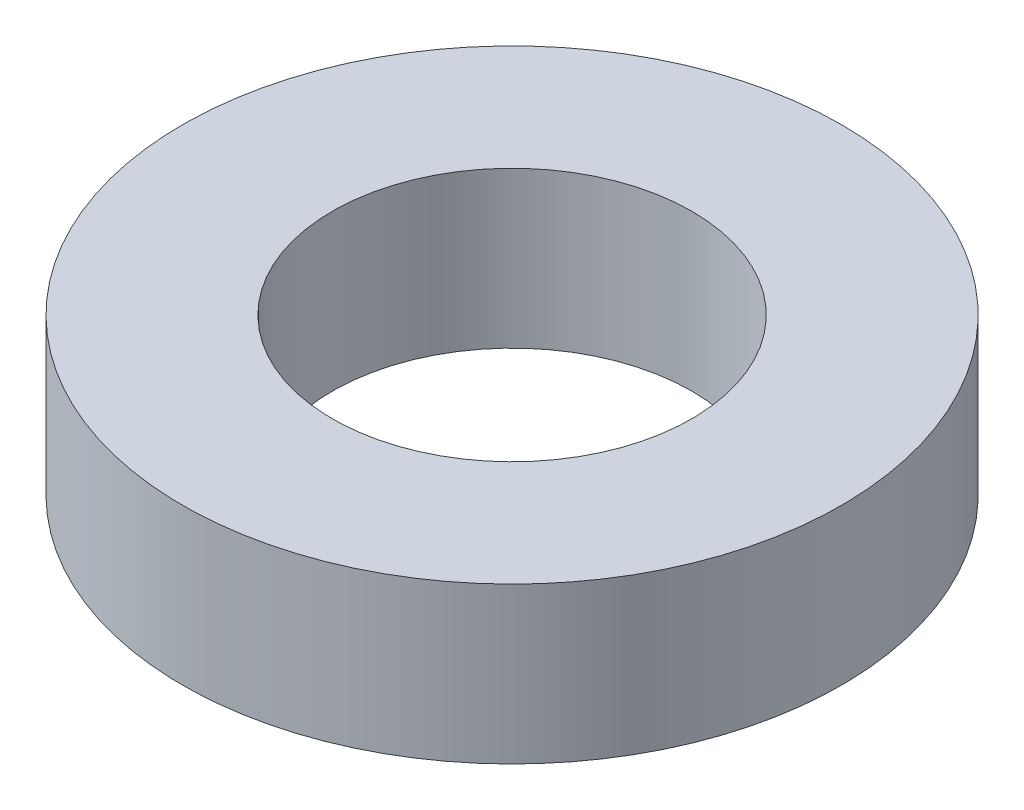
ISO-10303-21;
HEADER;
FILE_DESCRIPTION(('STEP AP214'),'2;1');
FILE_NAME('part.step','',(''),(''),'','','');
FILE_SCHEMA(('AUTOMOTIVE_DESIGN { 1 0 10303 214 1 1 1 1 }'));
ENDSEC;
DATA;
#1=APPLICATION_CONTEXT('core data for automotive mechanical design processes');
#2=APPLICATION_PROTOCOL_DEFINITION('international standard','automotive_design',2000,#1);
#3=PRODUCT_CONTEXT('',#1,'mechanical');
#4=PRODUCT('Part','Part','',(#3));
#5=PRODUCT_RELATED_PRODUCT_CATEGORY('part','',(#4));
#6=PRODUCT_DEFINITION_FORMATION('','',#4);
#7=PRODUCT_DEFINITION_CONTEXT('part definition',#1,'design');
#8=PRODUCT_DEFINITION('design','',#6,#7);
#9=PRODUCT_DEFINITION_SHAPE('','',#8);
#10=(LENGTH_UNIT() NAMED_UNIT(*) SI_UNIT(.MILLI.,.METRE.));
#11=(NAMED_UNIT(*) PLANE_ANGLE_UNIT() SI_UNIT($,.RADIAN.));
#12=(NAMED_UNIT(*) SI_UNIT($,.STERADIAN.) SOLID_ANGLE_UNIT());
#13=UNCERTAINTY_MEASURE_WITH_UNIT(LENGTH_MEASURE(1.E-05),#10,'distance_accuracy_value','');
#14=(GEOMETRIC_REPRESENTATION_CONTEXT(3) GLOBAL_UNCERTAINTY_ASSIGNED_CONTEXT((#13)) GLOBAL_UNIT_ASSIGNED_CONTEXT((#10,
#11,#12)) REPRESENTATION_CONTEXT('',''));
#15=CARTESIAN_POINT('',(0.,0.,0.));
#16=DIRECTION('',(0.,0.,1.));
#17=DIRECTION('',(1.,0.,0.));
#18=AXIS2_PLACEMENT_3D('',#15,#16,#17);
#19=CARTESIAN_POINT('',(0.,13.,0.));
#20=DIRECTION('',(0.,1.,0.));
#21=DIRECTION('',(0.,0.,1.));
#22=AXIS2_PLACEMENT_3D('',#19,#20,#21);
#23=PLANE('',#22);
#24=CARTESIAN_POINT('',(0.,13.,0.));
#25=DIRECTION('',(0.,1.,0.));
#26=DIRECTION('',(0.,0.,1.));
#27=AXIS2_PLACEMENT_3D('',#24,#25,#26);
#28=CIRCLE('',#27,27.5);
#29=CARTESIAN_POINT('',(0.,13.,-27.5));
#30=VERTEX_POINT('',#29);
#31=EDGE_CURVE('E10',#30,#30,#28,.T.);
#32=ORIENTED_EDGE('',*,*,#31,.T.);
#33=EDGE_LOOP('',(#32));
#34=FACE_BOUND('',#33,.T.);
#35=CARTESIAN_POINT('',(0.,13.,0.));
#36=DIRECTION('',(0.,1.,0.));
#37=DIRECTION('',(0.,0.,1.));
#38=AXIS2_PLACEMENT_3D('',#35,#36,#37);
#39=CIRCLE('',#38,15.);
#40=CARTESIAN_POINT('',(0.,13.,-15.));
#41=VERTEX_POINT('',#40);
#42=EDGE_CURVE('E42',#41,#41,#39,.T.);
#43=ORIENTED_EDGE('',*,*,#42,.F.);
#44=EDGE_LOOP('',(#43));
#45=FACE_BOUND('',#44,.T.);
#46=ADVANCED_FACE('F31',(#34,#45),#23,.T.);
#47=CARTESIAN_POINT('',(0.,0.,0.));
#48=DIRECTION('',(0.,1.,0.));
#49=DIRECTION('',(0.,0.,1.));
#50=AXIS2_PLACEMENT_3D('',#47,#48,#49);
#51=PLANE('',#50);
#52=CARTESIAN_POINT('',(0.,0.,0.));
#53=DIRECTION('',(0.,1.,0.));
#54=DIRECTION('',(0.,0.,1.));
#55=AXIS2_PLACEMENT_3D('',#52,#53,#54);
#56=CIRCLE('',#55,27.5);
#57=CARTESIAN_POINT('',(0.,0.,-27.5));
#58=VERTEX_POINT('',#57);
#59=EDGE_CURVE('E35',#58,#58,#56,.T.);
#60=ORIENTED_EDGE('',*,*,#59,.F.);
#61=EDGE_LOOP('',(#60));
#62=FACE_BOUND('',#61,.T.);
#63=CARTESIAN_POINT('',(0.,0.,0.));
#64=DIRECTION('',(0.,1.,0.));
#65=DIRECTION('',(0.,0.,1.));
#66=AXIS2_PLACEMENT_3D('',#63,#64,#65);
#67=CIRCLE('',#66,15.);
#68=CARTESIAN_POINT('',(0.,0.,-15.));
#69=VERTEX_POINT('',#68);
#70=EDGE_CURVE('E44',#69,#69,#67,.T.);
#71=ORIENTED_EDGE('',*,*,#70,.T.);
#72=EDGE_LOOP('',(#71));
#73=FACE_BOUND('',#72,.T.);
#74=ADVANCED_FACE('F54',(#62,#73),#51,.F.);
#75=CARTESIAN_POINT('',(0.,13.,0.));
#76=DIRECTION('',(0.,-1.,0.));
#77=DIRECTION('',(0.,0.,-1.));
#78=AXIS2_PLACEMENT_3D('',#75,#76,#77);
#79=CYLINDRICAL_SURFACE('',#78,27.5);
#80=CARTESIAN_POINT('',(0.,13.,-27.5));
#81=CARTESIAN_POINT('',(0.,12.8645833333333,-27.5));
#82=CARTESIAN_POINT('',(0.,12.7291666666667,-27.5));
#83=CARTESIAN_POINT('',(0.,12.4583333333333,-27.5));
#84=CARTESIAN_POINT('',(0.,12.3229166666667,-27.5));
#85=CARTESIAN_POINT('',(0.,12.0520833333333,-27.5));
#86=CARTESIAN_POINT('',(0.,11.9166666666667,-27.5));
#87=CARTESIAN_POINT('',(0.,11.6458333333333,-27.5));
#88=CARTESIAN_POINT('',(0.,11.5104166666667,-27.5));
#89=CARTESIAN_POINT('',(0.,11.2395833333333,-27.5));
#90=CARTESIAN_POINT('',(0.,11.1041666666667,-27.5));
#91=CARTESIAN_POINT('',(0.,10.8333333333333,-27.5));
#92=CARTESIAN_POINT('',(0.,10.6979166666667,-27.5));
#93=CARTESIAN_POINT('',(0.,10.4270833333333,-27.5));
#94=CARTESIAN_POINT('',(0.,10.2916666666667,-27.5));
#95=CARTESIAN_POINT('',(0.,10.0208333333333,-27.5));
#96=CARTESIAN_POINT('',(0.,9.88541666666667,-27.5));
#97=CARTESIAN_POINT('',(0.,9.61458333333333,-27.5));
#98=CARTESIAN_POINT('',(0.,9.47916666666667,-27.5));
#99=CARTESIAN_POINT('',(0.,9.20833333333333,-27.5));
#100=CARTESIAN_POINT('',(0.,9.07291666666666,-27.5));
#101=CARTESIAN_POINT('',(0.,8.80208333333333,-27.5));
#102=CARTESIAN_POINT('',(0.,8.66666666666667,-27.5));
#103=CARTESIAN_POINT('',(0.,8.39583333333333,-27.5));
#104=CARTESIAN_POINT('',(0.,8.26041666666667,-27.5));
#105=CARTESIAN_POINT('',(0.,7.98958333333333,-27.5));
#106=CARTESIAN_POINT('',(0.,7.85416666666667,-27.5));
#107=CARTESIAN_POINT('',(0.,7.58333333333333,-27.5));
#108=CARTESIAN_POINT('',(0.,7.44791666666667,-27.5));
#109=CARTESIAN_POINT('',(0.,7.17708333333333,-27.5));
#110=CARTESIAN_POINT('',(0.,7.04166666666667,-27.5));
#111=CARTESIAN_POINT('',(0.,6.77083333333333,-27.5));
#112=CARTESIAN_POINT('',(0.,6.63541666666667,-27.5));
#113=CARTESIAN_POINT('',(0.,6.36458333333333,-27.5));
#114=CARTESIAN_POINT('',(0.,6.22916666666667,-27.5));
#115=CARTESIAN_POINT('',(0.,5.95833333333333,-27.5));
#116=CARTESIAN_POINT('',(0.,5.82291666666667,-27.5));
#117=CARTESIAN_POINT('',(0.,5.55208333333333,-27.5));
#118=CARTESIAN_POINT('',(0.,5.41666666666667,-27.5));
#119=CARTESIAN_POINT('',(0.,5.14583333333333,-27.5));
#120=CARTESIAN_POINT('',(0.,5.01041666666667,-27.5));
#121=CARTESIAN_POINT('',(0.,4.73958333333333,-27.5));
#122=CARTESIAN_POINT('',(0.,4.60416666666667,-27.5));
#123=CARTESIAN_POINT('',(0.,4.33333333333333,-27.5));
#124=CARTESIAN_POINT('',(0.,4.19791666666667,-27.5));
#125=CARTESIAN_POINT('',(0.,3.92708333333333,-27.5));
#126=CARTESIAN_POINT('',(0.,3.79166666666667,-27.5));
#127=CARTESIAN_POINT('',(0.,3.52083333333333,-27.5));
#128=CARTESIAN_POINT('',(0.,3.38541666666667,-27.5));
#129=CARTESIAN_POINT('',(0.,3.11458333333333,-27.5));
#130=CARTESIAN_POINT('',(0.,2.97916666666667,-27.5));
#131=CARTESIAN_POINT('',(0.,2.70833333333333,-27.5));
#132=CARTESIAN_POINT('',(0.,2.57291666666667,-27.5));
#133=CARTESIAN_POINT('',(0.,2.30208333333333,-27.5));
#134=CARTESIAN_POINT('',(0.,2.16666666666667,-27.5));
#135=CARTESIAN_POINT('',(0.,1.89583333333333,-27.5));
#136=CARTESIAN_POINT('',(0.,1.76041666666667,-27.5));
#137=CARTESIAN_POINT('',(0.,1.48958333333333,-27.5));
#138=CARTESIAN_POINT('',(0.,1.35416666666667,-27.5));
#139=CARTESIAN_POINT('',(0.,1.08333333333333,-27.5));
#140=CARTESIAN_POINT('',(0.,0.947916666666667,-27.5));
#141=CARTESIAN_POINT('',(0.,0.677083333333334,-27.5));
#142=CARTESIAN_POINT('',(0.,0.541666666666667,-27.5));
#143=CARTESIAN_POINT('',(0.,0.270833333333334,-27.5));
#144=CARTESIAN_POINT('',(0.,0.135416666666667,-27.5));
#145=CARTESIAN_POINT('',(0.,0.,-27.5));
#146=B_SPLINE_CURVE_WITH_KNOTS('',3,(#80,#81,#82,#83,#84,#85,#86,#87,#88,#89,#90,#91,#92,#93,
#94,#95,#96,#97,#98,#99,#100,#101,#102,#103,#104,#105,#106,#107,#108,#109,#110,#111,#112,#113,
#114,#115,#116,#117,#118,#119,#120,#121,#122,#123,#124,#125,#126,#127,#128,#129,#130,#131,#132,
#133,#134,#135,#136,#137,#138,#139,#140,#141,#142,#143,#144,#145),.UNSPECIFIED.,.F.,.F.,(4,2,2,
2,2,2,2,2,2,2,2,2,2,2,2,2,2,2,2,2,2,2,2,2,2,2,2,2,2,2,2,2,4),(0.,0.40625,0.812500000000001,
1.21875,1.625,2.03125,2.4375,2.84375,3.25,3.65625,4.0625,4.46875,4.875,5.28125,5.6875,6.09375,
6.5,6.90625,7.3125,7.71875,8.125,8.53125,8.9375,9.34375,9.75,10.15625,10.5625,10.96875,11.375,
11.78125,12.1875,12.59375,13.),.UNSPECIFIED.);
#147=EDGE_CURVE('BSEAM33',#30,#58,#146,.T.);
#148=ORIENTED_EDGE('',*,*,#31,.F.);
#149=ORIENTED_EDGE('',*,*,#59,.T.);
#150=ORIENTED_EDGE('',*,*,#147,.T.);
#151=ORIENTED_EDGE('',*,*,#147,.F.);
#152=EDGE_LOOP('',(#148,#150,#149,#151));
#153=FACE_BOUND('',#152,.T.);
#154=ADVANCED_FACE('F33',(#153),#79,.T.);
#155=CARTESIAN_POINT('',(0.,13.,0.));
#156=DIRECTION('',(0.,-1.,0.));
#157=DIRECTION('',(0.,0.,-1.));
#158=AXIS2_PLACEMENT_3D('',#155,#156,#157);
#159=CYLINDRICAL_SURFACE('',#158,15.);
#160=CARTESIAN_POINT('',(0.,13.,-15.));
#161=CARTESIAN_POINT('',(0.,12.8645833333333,-15.));
#162=CARTESIAN_POINT('',(0.,12.7291666666667,-15.));
#163=CARTESIAN_POINT('',(0.,12.4583333333333,-15.));
#164=CARTESIAN_POINT('',(0.,12.3229166666667,-15.));
#165=CARTESIAN_POINT('',(0.,12.0520833333333,-15.));
#166=CARTESIAN_POINT('',(0.,11.9166666666667,-15.));
#167=CARTESIAN_POINT('',(0.,11.6458333333333,-15.));
#168=CARTESIAN_POINT('',(0.,11.5104166666667,-15.));
#169=CARTESIAN_POINT('',(0.,11.2395833333333,-15.));
#170=CARTESIAN_POINT('',(0.,11.1041666666667,-15.));
#171=CARTESIAN_POINT('',(0.,10.8333333333333,-15.));
#172=CARTESIAN_POINT('',(0.,10.6979166666667,-15.));
#173=CARTESIAN_POINT('',(0.,10.4270833333333,-15.));
#174=CARTESIAN_POINT('',(0.,10.2916666666667,-15.));
#175=CARTESIAN_POINT('',(0.,10.0208333333333,-15.));
#176=CARTESIAN_POINT('',(0.,9.88541666666667,-15.));
#177=CARTESIAN_POINT('',(0.,9.61458333333333,-15.));
#178=CARTESIAN_POINT('',(0.,9.47916666666667,-15.));
#179=CARTESIAN_POINT('',(0.,9.20833333333333,-15.));
#180=CARTESIAN_POINT('',(0.,9.07291666666666,-15.));
#181=CARTESIAN_POINT('',(0.,8.80208333333333,-15.));
#182=CARTESIAN_POINT('',(0.,8.66666666666667,-15.));
#183=CARTESIAN_POINT('',(0.,8.39583333333333,-15.));
#184=CARTESIAN_POINT('',(0.,8.26041666666667,-15.));
#185=CARTESIAN_POINT('',(0.,7.98958333333333,-15.));
#186=CARTESIAN_POINT('',(0.,7.85416666666667,-15.));
#187=CARTESIAN_POINT('',(0.,7.58333333333333,-15.));
#188=CARTESIAN_POINT('',(0.,7.44791666666667,-15.));
#189=CARTESIAN_POINT('',(0.,7.17708333333333,-15.));
#190=CARTESIAN_POINT('',(0.,7.04166666666667,-15.));
#191=CARTESIAN_POINT('',(0.,6.77083333333333,-15.));
#192=CARTESIAN_POINT('',(0.,6.63541666666667,-15.));
#193=CARTESIAN_POINT('',(0.,6.36458333333333,-15.));
#194=CARTESIAN_POINT('',(0.,6.22916666666667,-15.));
#195=CARTESIAN_POINT('',(0.,5.95833333333333,-15.));
#196=CARTESIAN_POINT('',(0.,5.82291666666667,-15.));
#197=CARTESIAN_POINT('',(0.,5.55208333333333,-15.));
#198=CARTESIAN_POINT('',(0.,5.41666666666667,-15.));
#199=CARTESIAN_POINT('',(0.,5.14583333333333,-15.));
#200=CARTESIAN_POINT('',(0.,5.01041666666667,-15.));
#201=CARTESIAN_POINT('',(0.,4.73958333333333,-15.));
#202=CARTESIAN_POINT('',(0.,4.60416666666667,-15.));
#203=CARTESIAN_POINT('',(0.,4.33333333333333,-15.));
#204=CARTESIAN_POINT('',(0.,4.19791666666667,-15.));
#205=CARTESIAN_POINT('',(0.,3.92708333333333,-15.));
#206=CARTESIAN_POINT('',(0.,3.79166666666667,-15.));
#207=CARTESIAN_POINT('',(0.,3.52083333333333,-15.));
#208=CARTESIAN_POINT('',(0.,3.38541666666667,-15.));
#209=CARTESIAN_POINT('',(0.,3.11458333333333,-15.));
#210=CARTESIAN_POINT('',(0.,2.97916666666667,-15.));
#211=CARTESIAN_POINT('',(0.,2.70833333333333,-15.));
#212=CARTESIAN_POINT('',(0.,2.57291666666667,-15.));
#213=CARTESIAN_POINT('',(0.,2.30208333333333,-15.));
#214=CARTESIAN_POINT('',(0.,2.16666666666667,-15.));
#215=CARTESIAN_POINT('',(0.,1.89583333333333,-15.));
#216=CARTESIAN_POINT('',(0.,1.76041666666667,-15.));
#217=CARTESIAN_POINT('',(0.,1.48958333333333,-15.));
#218=CARTESIAN_POINT('',(0.,1.35416666666667,-15.));
#219=CARTESIAN_POINT('',(0.,1.08333333333333,-15.));
#220=CARTESIAN_POINT('',(0.,0.947916666666667,-15.));
#221=CARTESIAN_POINT('',(0.,0.677083333333334,-15.));
#222=CARTESIAN_POINT('',(0.,0.541666666666667,-15.));
#223=CARTESIAN_POINT('',(0.,0.270833333333334,-15.));
#224=CARTESIAN_POINT('',(0.,0.135416666666667,-15.));
#225=CARTESIAN_POINT('',(0.,0.,-15.));
#226=B_SPLINE_CURVE_WITH_KNOTS('',3,(#160,#161,#162,#163,#164,#165,#166,#167,#168,#169,#170,
#171,#172,#173,#174,#175,#176,#177,#178,#179,#180,#181,#182,#183,#184,#185,#186,#187,#188,#189,
#190,#191,#192,#193,#194,#195,#196,#197,#198,#199,#200,#201,#202,#203,#204,#205,#206,#207,#208,
#209,#210,#211,#212,#213,#214,#215,#216,#217,#218,#219,#220,#221,#222,#223,#224,#225),
.UNSPECIFIED.,.F.,.F.,(4,2,2,2,2,2,2,2,2,2,2,2,2,2,2,2,2,2,2,2,2,2,2,2,2,2,2,2,2,2,2,2,4),(0.,
0.40625,0.812500000000001,1.21875,1.625,2.03125,2.4375,2.84375,3.25,3.65625,4.0625,4.46875,
4.875,5.28125,5.6875,6.09375,6.5,6.90625,7.3125,7.71875,8.125,8.53125,8.9375,9.34375,9.75,
10.15625,10.5625,10.96875,11.375,11.78125,12.1875,12.59375,13.),.UNSPECIFIED.);
#227=EDGE_CURVE('BSEAM50',#41,#69,#226,.T.);
#228=ORIENTED_EDGE('',*,*,#42,.T.);
#229=ORIENTED_EDGE('',*,*,#70,.F.);
#230=ORIENTED_EDGE('',*,*,#227,.T.);
#231=ORIENTED_EDGE('',*,*,#227,.F.);
#232=EDGE_LOOP('',(#228,#230,#229,#231));
#233=FACE_BOUND('',#232,.T.);
#234=ADVANCED_FACE('F50',(#233),#159,.F.);
#235=CLOSED_SHELL('',(#46,#74,#154,#234));
#236=MANIFOLD_SOLID_BREP('B2',#235);
#237=ADVANCED_BREP_SHAPE_REPRESENTATION('',(#18,#236),#14);
#238=SHAPE_DEFINITION_REPRESENTATION(#9,#237);
ENDSEC;
END-ISO-10303-21;
